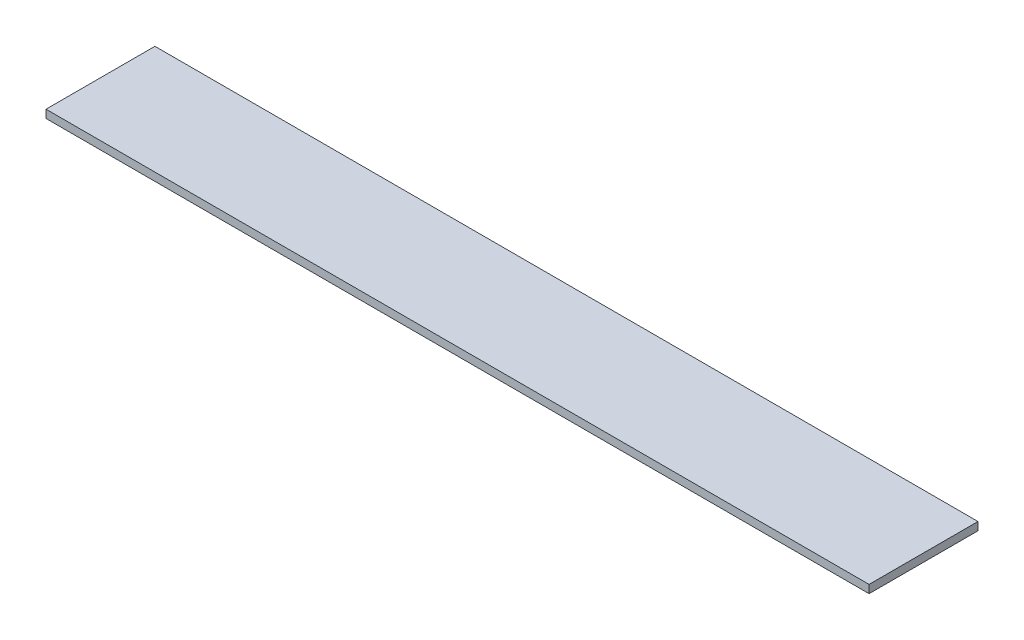
ISO-10303-21;
HEADER;
FILE_DESCRIPTION(('STEP AP214'),'2;1');
FILE_NAME('part.step','',(''),(''),'','','');
FILE_SCHEMA(('AUTOMOTIVE_DESIGN { 1 0 10303 214 1 1 1 1 }'));
ENDSEC;
DATA;
#1=APPLICATION_CONTEXT('core data for automotive mechanical design processes');
#2=APPLICATION_PROTOCOL_DEFINITION('international standard','automotive_design',2000,#1);
#3=PRODUCT_CONTEXT('',#1,'mechanical');
#4=PRODUCT('Part','Part','',(#3));
#5=PRODUCT_RELATED_PRODUCT_CATEGORY('part','',(#4));
#6=PRODUCT_DEFINITION_FORMATION('','',#4);
#7=PRODUCT_DEFINITION_CONTEXT('part definition',#1,'design');
#8=PRODUCT_DEFINITION('design','',#6,#7);
#9=PRODUCT_DEFINITION_SHAPE('','',#8);
#10=(LENGTH_UNIT() NAMED_UNIT(*) SI_UNIT(.MILLI.,.METRE.));
#11=(NAMED_UNIT(*) PLANE_ANGLE_UNIT() SI_UNIT($,.RADIAN.));
#12=(NAMED_UNIT(*) SI_UNIT($,.STERADIAN.) SOLID_ANGLE_UNIT());
#13=UNCERTAINTY_MEASURE_WITH_UNIT(LENGTH_MEASURE(1.E-05),#10,'distance_accuracy_value','');
#14=(GEOMETRIC_REPRESENTATION_CONTEXT(3) GLOBAL_UNCERTAINTY_ASSIGNED_CONTEXT((#13)) GLOBAL_UNIT_ASSIGNED_CONTEXT((#10,
#11,#12)) REPRESENTATION_CONTEXT('',''));
#15=CARTESIAN_POINT('',(0.,0.,0.));
#16=DIRECTION('',(0.,0.,1.));
#17=DIRECTION('',(1.,0.,0.));
#18=AXIS2_PLACEMENT_3D('',#15,#16,#17);
#19=CARTESIAN_POINT('',(-6.,6.,-456.000000000003));
#20=DIRECTION('',(1.,0.,0.));
#21=DIRECTION('',(0.,0.,-1.));
#22=AXIS2_PLACEMENT_3D('',#19,#20,#21);
#23=PLANE('',#22);
#24=DIRECTION('',(0.,0.,1.));
#25=VECTOR('',#24,1.);
#26=CARTESIAN_POINT('',(-6.,0.,-456.000000000003));
#27=LINE('',#26,#25);
#28=CARTESIAN_POINT('',(-6.,0.,-456.000000000003));
#29=VERTEX_POINT('',#28);
#30=CARTESIAN_POINT('',(-5.99999999999999,0.,-375.000000000003));
#31=VERTEX_POINT('',#30);
#32=EDGE_CURVE('E96',#29,#31,#27,.T.);
#33=ORIENTED_EDGE('',*,*,#32,.T.);
#34=DIRECTION('',(0.,-1.,0.));
#35=VECTOR('',#34,1.);
#36=CARTESIAN_POINT('',(-5.99999999999999,6.,-375.000000000003));
#37=LINE('',#36,#35);
#38=CARTESIAN_POINT('',(-5.99999999999999,6.,-375.000000000003));
#39=VERTEX_POINT('',#38);
#40=EDGE_CURVE('E11',#39,#31,#37,.T.);
#41=ORIENTED_EDGE('',*,*,#40,.F.);
#42=DIRECTION('',(0.,0.,1.));
#43=VECTOR('',#42,1.);
#44=CARTESIAN_POINT('',(-6.,6.,-456.000000000003));
#45=LINE('',#44,#43);
#46=CARTESIAN_POINT('',(-6.,6.,-456.000000000003));
#47=VERTEX_POINT('',#46);
#48=EDGE_CURVE('E84',#47,#39,#45,.T.);
#49=ORIENTED_EDGE('',*,*,#48,.F.);
#50=DIRECTION('',(0.,-1.,0.));
#51=VECTOR('',#50,1.);
#52=CARTESIAN_POINT('',(-6.,6.,-456.000000000003));
#53=LINE('',#52,#51);
#54=EDGE_CURVE('E92',#47,#29,#53,.T.);
#55=ORIENTED_EDGE('',*,*,#54,.T.);
#56=EDGE_LOOP('',(#33,#41,#49,#55));
#57=FACE_BOUND('',#56,.T.);
#58=ADVANCED_FACE('F33',(#57),#23,.F.);
#59=CARTESIAN_POINT('',(-5.99999999999999,6.,-375.000000000003));
#60=DIRECTION('',(0.,0.,-1.));
#61=DIRECTION('',(-1.,0.,0.));
#62=AXIS2_PLACEMENT_3D('',#59,#60,#61);
#63=PLANE('',#62);
#64=DIRECTION('',(1.,0.,0.));
#65=VECTOR('',#64,1.);
#66=CARTESIAN_POINT('',(-5.99999999999999,0.,-375.000000000003));
#67=LINE('',#66,#65);
#68=CARTESIAN_POINT('',(606.,0.,-375.000000000003));
#69=VERTEX_POINT('',#68);
#70=EDGE_CURVE('E88',#31,#69,#67,.T.);
#71=ORIENTED_EDGE('',*,*,#70,.T.);
#72=DIRECTION('',(0.,-1.,0.));
#73=VECTOR('',#72,1.);
#74=CARTESIAN_POINT('',(606.,6.,-375.000000000003));
#75=LINE('',#74,#73);
#76=CARTESIAN_POINT('',(606.,6.,-375.000000000003));
#77=VERTEX_POINT('',#76);
#78=EDGE_CURVE('E41',#77,#69,#75,.T.);
#79=ORIENTED_EDGE('',*,*,#78,.F.);
#80=DIRECTION('',(1.,0.,0.));
#81=VECTOR('',#80,1.);
#82=CARTESIAN_POINT('',(-5.99999999999999,6.,-375.000000000003));
#83=LINE('',#82,#81);
#84=EDGE_CURVE('E79',#39,#77,#83,.T.);
#85=ORIENTED_EDGE('',*,*,#84,.F.);
#86=ORIENTED_EDGE('',*,*,#40,.T.);
#87=EDGE_LOOP('',(#71,#79,#85,#86));
#88=FACE_BOUND('',#87,.T.);
#89=ADVANCED_FACE('F87',(#88),#63,.F.);
#90=CARTESIAN_POINT('',(606.,6.,-456.000000000003));
#91=DIRECTION('',(-1.,0.,0.));
#92=DIRECTION('',(0.,0.,1.));
#93=AXIS2_PLACEMENT_3D('',#90,#91,#92);
#94=PLANE('',#93);
#95=DIRECTION('',(0.,0.,-1.));
#96=VECTOR('',#95,1.);
#97=CARTESIAN_POINT('',(606.,0.,-456.000000000003));
#98=LINE('',#97,#96);
#99=CARTESIAN_POINT('',(606.,0.,-456.000000000003));
#100=VERTEX_POINT('',#99);
#101=EDGE_CURVE('E66',#69,#100,#98,.T.);
#102=ORIENTED_EDGE('',*,*,#101,.T.);
#103=DIRECTION('',(0.,-1.,0.));
#104=VECTOR('',#103,1.);
#105=CARTESIAN_POINT('',(606.,6.,-456.000000000003));
#106=LINE('',#105,#104);
#107=CARTESIAN_POINT('',(606.,6.,-456.000000000003));
#108=VERTEX_POINT('',#107);
#109=EDGE_CURVE('E89',#108,#100,#106,.T.);
#110=ORIENTED_EDGE('',*,*,#109,.F.);
#111=DIRECTION('',(0.,0.,-1.));
#112=VECTOR('',#111,1.);
#113=CARTESIAN_POINT('',(606.,6.,-456.000000000003));
#114=LINE('',#113,#112);
#115=EDGE_CURVE('E82',#77,#108,#114,.T.);
#116=ORIENTED_EDGE('',*,*,#115,.F.);
#117=ORIENTED_EDGE('',*,*,#78,.T.);
#118=EDGE_LOOP('',(#102,#110,#116,#117));
#119=FACE_BOUND('',#118,.T.);
#120=ADVANCED_FACE('F90',(#119),#94,.F.);
#121=CARTESIAN_POINT('',(-6.,6.,-456.000000000003));
#122=DIRECTION('',(0.,0.,1.));
#123=DIRECTION('',(1.,0.,0.));
#124=AXIS2_PLACEMENT_3D('',#121,#122,#123);
#125=PLANE('',#124);
#126=DIRECTION('',(-1.,0.,0.));
#127=VECTOR('',#126,1.);
#128=CARTESIAN_POINT('',(-6.,0.,-456.000000000003));
#129=LINE('',#128,#127);
#130=EDGE_CURVE('E72',#100,#29,#129,.T.);
#131=ORIENTED_EDGE('',*,*,#130,.T.);
#132=ORIENTED_EDGE('',*,*,#54,.F.);
#133=DIRECTION('',(-1.,0.,0.));
#134=VECTOR('',#133,1.);
#135=CARTESIAN_POINT('',(-6.,6.,-456.000000000003));
#136=LINE('',#135,#134);
#137=EDGE_CURVE('E49',#108,#47,#136,.T.);
#138=ORIENTED_EDGE('',*,*,#137,.F.);
#139=ORIENTED_EDGE('',*,*,#109,.T.);
#140=EDGE_LOOP('',(#131,#132,#138,#139));
#141=FACE_BOUND('',#140,.T.);
#142=ADVANCED_FACE('F103',(#141),#125,.F.);
#143=CARTESIAN_POINT('',(0.,6.,0.));
#144=DIRECTION('',(0.,1.,0.));
#145=DIRECTION('',(0.,0.,1.));
#146=AXIS2_PLACEMENT_3D('',#143,#144,#145);
#147=PLANE('',#146);
#148=ORIENTED_EDGE('',*,*,#48,.T.);
#149=ORIENTED_EDGE('',*,*,#84,.T.);
#150=ORIENTED_EDGE('',*,*,#115,.T.);
#151=ORIENTED_EDGE('',*,*,#137,.T.);
#152=EDGE_LOOP('',(#148,#149,#150,#151));
#153=FACE_BOUND('',#152,.T.);
#154=ADVANCED_FACE('F80',(#153),#147,.T.);
#155=CARTESIAN_POINT('',(0.,0.,0.));
#156=DIRECTION('',(0.,1.,0.));
#157=DIRECTION('',(0.,0.,1.));
#158=AXIS2_PLACEMENT_3D('',#155,#156,#157);
#159=PLANE('',#158);
#160=ORIENTED_EDGE('',*,*,#32,.F.);
#161=ORIENTED_EDGE('',*,*,#130,.F.);
#162=ORIENTED_EDGE('',*,*,#101,.F.);
#163=ORIENTED_EDGE('',*,*,#70,.F.);
#164=EDGE_LOOP('',(#160,#161,#162,#163));
#165=FACE_BOUND('',#164,.T.);
#166=ADVANCED_FACE('F106',(#165),#159,.F.);
#167=CLOSED_SHELL('',(#58,#89,#120,#142,#154,#166));
#168=MANIFOLD_SOLID_BREP('B2',#167);
#169=ADVANCED_BREP_SHAPE_REPRESENTATION('',(#18,#168),#14);
#170=SHAPE_DEFINITION_REPRESENTATION(#9,#169);
ENDSEC;
END-ISO-10303-21;
